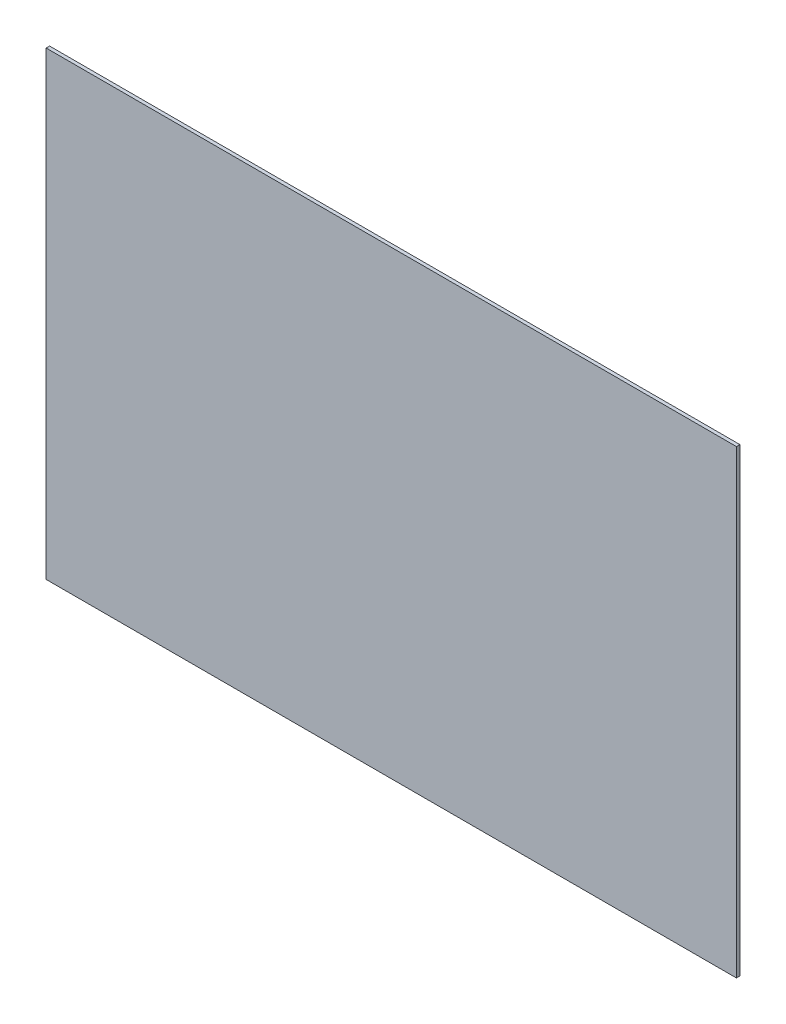
ISO-10303-21;
HEADER;
FILE_DESCRIPTION(('STEP AP214'),'2;1');
FILE_NAME('part.step','',(''),(''),'','','');
FILE_SCHEMA(('AUTOMOTIVE_DESIGN { 1 0 10303 214 1 1 1 1 }'));
ENDSEC;
DATA;
#1=APPLICATION_CONTEXT('core data for automotive mechanical design processes');
#2=APPLICATION_PROTOCOL_DEFINITION('international standard','automotive_design',2000,#1);
#3=PRODUCT_CONTEXT('',#1,'mechanical');
#4=PRODUCT('Part','Part','',(#3));
#5=PRODUCT_RELATED_PRODUCT_CATEGORY('part','',(#4));
#6=PRODUCT_DEFINITION_FORMATION('','',#4);
#7=PRODUCT_DEFINITION_CONTEXT('part definition',#1,'design');
#8=PRODUCT_DEFINITION('design','',#6,#7);
#9=PRODUCT_DEFINITION_SHAPE('','',#8);
#10=(LENGTH_UNIT() NAMED_UNIT(*) SI_UNIT(.MILLI.,.METRE.));
#11=(NAMED_UNIT(*) PLANE_ANGLE_UNIT() SI_UNIT($,.RADIAN.));
#12=(NAMED_UNIT(*) SI_UNIT($,.STERADIAN.) SOLID_ANGLE_UNIT());
#13=UNCERTAINTY_MEASURE_WITH_UNIT(LENGTH_MEASURE(1.E-05),#10,'distance_accuracy_value','');
#14=(GEOMETRIC_REPRESENTATION_CONTEXT(3) GLOBAL_UNCERTAINTY_ASSIGNED_CONTEXT((#13)) GLOBAL_UNIT_ASSIGNED_CONTEXT((#10,
#11,#12)) REPRESENTATION_CONTEXT('',''));
#15=CARTESIAN_POINT('',(0.,0.,0.));
#16=DIRECTION('',(0.,0.,1.));
#17=DIRECTION('',(1.,0.,0.));
#18=AXIS2_PLACEMENT_3D('',#15,#16,#17);
#19=CARTESIAN_POINT('',(-479.221062810974,123.239436619718,3.));
#20=DIRECTION('',(1.,0.,0.));
#21=DIRECTION('',(0.,1.,0.));
#22=AXIS2_PLACEMENT_3D('',#19,#20,#21);
#23=PLANE('',#22);
#24=DIRECTION('',(0.,-1.,0.));
#25=VECTOR('',#24,1.);
#26=CARTESIAN_POINT('',(-479.221062810974,123.239436619718,0.));
#27=LINE('',#26,#25);
#28=CARTESIAN_POINT('',(-479.221062810974,123.239436619718,0.));
#29=VERTEX_POINT('',#28);
#30=CARTESIAN_POINT('',(-479.221062810974,-276.760563380282,0.));
#31=VERTEX_POINT('',#30);
#32=EDGE_CURVE('E107',#29,#31,#27,.T.);
#33=ORIENTED_EDGE('',*,*,#32,.T.);
#34=DIRECTION('',(0.,0.,-1.));
#35=VECTOR('',#34,1.);
#36=CARTESIAN_POINT('',(-479.221062810974,-276.760563380282,3.));
#37=LINE('',#36,#35);
#38=CARTESIAN_POINT('',(-479.221062810974,-276.760563380282,3.));
#39=VERTEX_POINT('',#38);
#40=EDGE_CURVE('E11',#39,#31,#37,.T.);
#41=ORIENTED_EDGE('',*,*,#40,.F.);
#42=DIRECTION('',(0.,-1.,0.));
#43=VECTOR('',#42,1.);
#44=CARTESIAN_POINT('',(-479.221062810974,123.239436619718,3.));
#45=LINE('',#44,#43);
#46=CARTESIAN_POINT('',(-479.221062810974,123.239436619718,3.));
#47=VERTEX_POINT('',#46);
#48=EDGE_CURVE('E91',#47,#39,#45,.T.);
#49=ORIENTED_EDGE('',*,*,#48,.F.);
#50=DIRECTION('',(0.,0.,-1.));
#51=VECTOR('',#50,1.);
#52=CARTESIAN_POINT('',(-479.221062810974,123.239436619718,3.));
#53=LINE('',#52,#51);
#54=EDGE_CURVE('E103',#47,#29,#53,.T.);
#55=ORIENTED_EDGE('',*,*,#54,.T.);
#56=EDGE_LOOP('',(#33,#41,#49,#55));
#57=FACE_BOUND('',#56,.T.);
#58=ADVANCED_FACE('F39',(#57),#23,.F.);
#59=CARTESIAN_POINT('',(-479.221062810974,-276.760563380282,3.));
#60=DIRECTION('',(0.,1.,0.));
#61=DIRECTION('',(0.,0.,1.));
#62=AXIS2_PLACEMENT_3D('',#59,#60,#61);
#63=PLANE('',#62);
#64=DIRECTION('',(1.,0.,0.));
#65=VECTOR('',#64,1.);
#66=CARTESIAN_POINT('',(-479.221062810974,-276.760563380282,0.));
#67=LINE('',#66,#65);
#68=CARTESIAN_POINT('',(120.778937189026,-276.760563380282,0.));
#69=VERTEX_POINT('',#68);
#70=EDGE_CURVE('E96',#31,#69,#67,.T.);
#71=ORIENTED_EDGE('',*,*,#70,.T.);
#72=DIRECTION('',(0.,0.,-1.));
#73=VECTOR('',#72,1.);
#74=CARTESIAN_POINT('',(120.778937189026,-276.760563380282,3.));
#75=LINE('',#74,#73);
#76=CARTESIAN_POINT('',(120.778937189026,-276.760563380282,3.));
#77=VERTEX_POINT('',#76);
#78=EDGE_CURVE('E48',#77,#69,#75,.T.);
#79=ORIENTED_EDGE('',*,*,#78,.F.);
#80=DIRECTION('',(1.,0.,0.));
#81=VECTOR('',#80,1.);
#82=CARTESIAN_POINT('',(-479.221062810974,-276.760563380282,3.));
#83=LINE('',#82,#81);
#84=EDGE_CURVE('E86',#39,#77,#83,.T.);
#85=ORIENTED_EDGE('',*,*,#84,.F.);
#86=ORIENTED_EDGE('',*,*,#40,.T.);
#87=EDGE_LOOP('',(#71,#79,#85,#86));
#88=FACE_BOUND('',#87,.T.);
#89=ADVANCED_FACE('F95',(#88),#63,.F.);
#90=CARTESIAN_POINT('',(120.778937189026,123.239436619718,3.));
#91=DIRECTION('',(-1.,0.,0.));
#92=DIRECTION('',(0.,-1.,0.));
#93=AXIS2_PLACEMENT_3D('',#90,#91,#92);
#94=PLANE('',#93);
#95=DIRECTION('',(0.,1.,0.));
#96=VECTOR('',#95,1.);
#97=CARTESIAN_POINT('',(120.778937189026,123.239436619718,0.));
#98=LINE('',#97,#96);
#99=CARTESIAN_POINT('',(120.778937189026,123.239436619718,0.));
#100=VERTEX_POINT('',#99);
#101=EDGE_CURVE('E73',#69,#100,#98,.T.);
#102=ORIENTED_EDGE('',*,*,#101,.T.);
#103=DIRECTION('',(0.,0.,-1.));
#104=VECTOR('',#103,1.);
#105=CARTESIAN_POINT('',(120.778937189026,123.239436619718,3.));
#106=LINE('',#105,#104);
#107=CARTESIAN_POINT('',(120.778937189026,123.239436619718,3.));
#108=VERTEX_POINT('',#107);
#109=EDGE_CURVE('E98',#108,#100,#106,.T.);
#110=ORIENTED_EDGE('',*,*,#109,.F.);
#111=DIRECTION('',(0.,1.,0.));
#112=VECTOR('',#111,1.);
#113=CARTESIAN_POINT('',(120.778937189026,123.239436619718,3.));
#114=LINE('',#113,#112);
#115=EDGE_CURVE('E89',#77,#108,#114,.T.);
#116=ORIENTED_EDGE('',*,*,#115,.F.);
#117=ORIENTED_EDGE('',*,*,#78,.T.);
#118=EDGE_LOOP('',(#102,#110,#116,#117));
#119=FACE_BOUND('',#118,.T.);
#120=ADVANCED_FACE('F99',(#119),#94,.F.);
#121=CARTESIAN_POINT('',(-479.221062810974,123.239436619718,3.));
#122=DIRECTION('',(0.,-1.,0.));
#123=DIRECTION('',(0.,0.,-1.));
#124=AXIS2_PLACEMENT_3D('',#121,#122,#123);
#125=PLANE('',#124);
#126=DIRECTION('',(-1.,0.,0.));
#127=VECTOR('',#126,1.);
#128=CARTESIAN_POINT('',(-479.221062810974,123.239436619718,0.));
#129=LINE('',#128,#127);
#130=EDGE_CURVE('E79',#100,#29,#129,.T.);
#131=ORIENTED_EDGE('',*,*,#130,.T.);
#132=ORIENTED_EDGE('',*,*,#54,.F.);
#133=DIRECTION('',(-1.,0.,0.));
#134=VECTOR('',#133,1.);
#135=CARTESIAN_POINT('',(-479.221062810974,123.239436619718,3.));
#136=LINE('',#135,#134);
#137=EDGE_CURVE('E56',#108,#47,#136,.T.);
#138=ORIENTED_EDGE('',*,*,#137,.F.);
#139=ORIENTED_EDGE('',*,*,#109,.T.);
#140=EDGE_LOOP('',(#131,#132,#138,#139));
#141=FACE_BOUND('',#140,.T.);
#142=ADVANCED_FACE('F120',(#141),#125,.F.);
#143=CARTESIAN_POINT('',(0.,0.,3.));
#144=DIRECTION('',(0.,0.,1.));
#145=DIRECTION('',(1.,0.,0.));
#146=AXIS2_PLACEMENT_3D('',#143,#144,#145);
#147=PLANE('',#146);
#148=ORIENTED_EDGE('',*,*,#48,.T.);
#149=ORIENTED_EDGE('',*,*,#84,.T.);
#150=ORIENTED_EDGE('',*,*,#115,.T.);
#151=ORIENTED_EDGE('',*,*,#137,.T.);
#152=EDGE_LOOP('',(#148,#149,#150,#151));
#153=FACE_BOUND('',#152,.T.);
#154=ADVANCED_FACE('F87',(#153),#147,.T.);
#155=CARTESIAN_POINT('',(0.,0.,0.));
#156=DIRECTION('',(0.,0.,1.));
#157=DIRECTION('',(1.,0.,0.));
#158=AXIS2_PLACEMENT_3D('',#155,#156,#157);
#159=PLANE('',#158);
#160=ORIENTED_EDGE('',*,*,#32,.F.);
#161=ORIENTED_EDGE('',*,*,#130,.F.);
#162=ORIENTED_EDGE('',*,*,#101,.F.);
#163=ORIENTED_EDGE('',*,*,#70,.F.);
#164=EDGE_LOOP('',(#160,#161,#162,#163));
#165=FACE_BOUND('',#164,.T.);
#166=ADVANCED_FACE('F123',(#165),#159,.F.);
#167=CLOSED_SHELL('',(#58,#89,#120,#142,#154,#166));
#168=MANIFOLD_SOLID_BREP('B2',#167);
#169=ADVANCED_BREP_SHAPE_REPRESENTATION('',(#18,#168),#14);
#170=SHAPE_DEFINITION_REPRESENTATION(#9,#169);
ENDSEC;
END-ISO-10303-21;
